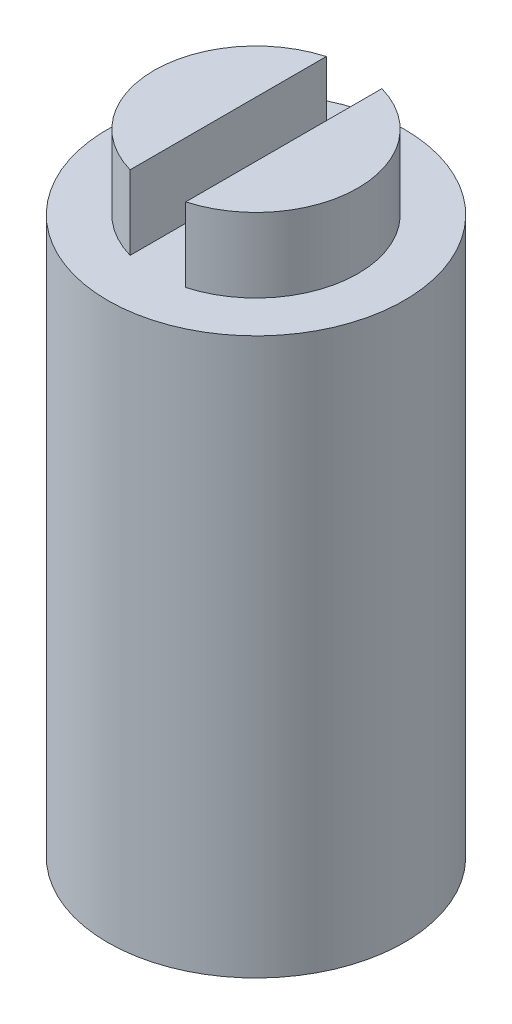
ISO-10303-21;
HEADER;
FILE_DESCRIPTION(('STEP AP214'),'2;1');
FILE_NAME('part.step','',(''),(''),'','','');
FILE_SCHEMA(('AUTOMOTIVE_DESIGN { 1 0 10303 214 1 1 1 1 }'));
ENDSEC;
DATA;
#1=APPLICATION_CONTEXT('core data for automotive mechanical design processes');
#2=APPLICATION_PROTOCOL_DEFINITION('international standard','automotive_design',2000,#1);
#3=PRODUCT_CONTEXT('',#1,'mechanical');
#4=PRODUCT('Part','Part','',(#3));
#5=PRODUCT_RELATED_PRODUCT_CATEGORY('part','',(#4));
#6=PRODUCT_DEFINITION_FORMATION('','',#4);
#7=PRODUCT_DEFINITION_CONTEXT('part definition',#1,'design');
#8=PRODUCT_DEFINITION('design','',#6,#7);
#9=PRODUCT_DEFINITION_SHAPE('','',#8);
#10=(LENGTH_UNIT() NAMED_UNIT(*) SI_UNIT(.MILLI.,.METRE.));
#11=(NAMED_UNIT(*) PLANE_ANGLE_UNIT() SI_UNIT($,.RADIAN.));
#12=(NAMED_UNIT(*) SI_UNIT($,.STERADIAN.) SOLID_ANGLE_UNIT());
#13=UNCERTAINTY_MEASURE_WITH_UNIT(LENGTH_MEASURE(1.E-05),#10,'distance_accuracy_value','');
#14=(GEOMETRIC_REPRESENTATION_CONTEXT(3) GLOBAL_UNCERTAINTY_ASSIGNED_CONTEXT((#13)) GLOBAL_UNIT_ASSIGNED_CONTEXT((#10,
#11,#12)) REPRESENTATION_CONTEXT('',''));
#15=CARTESIAN_POINT('',(0.,0.,0.));
#16=DIRECTION('',(0.,0.,1.));
#17=DIRECTION('',(1.,0.,0.));
#18=AXIS2_PLACEMENT_3D('',#15,#16,#17);
#19=CARTESIAN_POINT('',(0.,0.,0.));
#20=DIRECTION('',(0.,1.,0.));
#21=DIRECTION('',(0.,0.,1.));
#22=AXIS2_PLACEMENT_3D('',#19,#20,#21);
#23=PLANE('',#22);
#24=CARTESIAN_POINT('',(0.,0.,0.));
#25=DIRECTION('',(0.,1.,0.));
#26=DIRECTION('',(0.,0.,1.));
#27=AXIS2_PLACEMENT_3D('',#24,#25,#26);
#28=CIRCLE('',#27,4.);
#29=CARTESIAN_POINT('',(0.,0.,4.));
#30=VERTEX_POINT('',#29);
#31=EDGE_CURVE('E44',#30,#30,#28,.T.);
#32=ORIENTED_EDGE('',*,*,#31,.T.);
#33=EDGE_LOOP('',(#32));
#34=FACE_BOUND('',#33,.T.);
#35=DIRECTION('',(0.,0.,-1.));
#36=VECTOR('',#35,1.);
#37=CARTESIAN_POINT('',(-0.75,0.,-2.64575131106459));
#38=LINE('',#37,#36);
#39=CARTESIAN_POINT('',(-0.75,0.,2.64575131106459));
#40=VERTEX_POINT('',#39);
#41=CARTESIAN_POINT('',(-0.75,0.,-2.64575131106459));
#42=VERTEX_POINT('',#41);
#43=EDGE_CURVE('E99',#40,#42,#38,.T.);
#44=ORIENTED_EDGE('',*,*,#43,.F.);
#45=CARTESIAN_POINT('',(0.,0.,0.));
#46=DIRECTION('',(0.,1.,0.));
#47=DIRECTION('',(0.,0.,1.));
#48=AXIS2_PLACEMENT_3D('',#45,#46,#47);
#49=CIRCLE('',#48,2.75);
#50=EDGE_CURVE('E63',#42,#40,#49,.T.);
#51=ORIENTED_EDGE('',*,*,#50,.F.);
#52=EDGE_LOOP('',(#44,#51));
#53=FACE_BOUND('',#52,.T.);
#54=DIRECTION('',(0.,0.,1.));
#55=VECTOR('',#54,1.);
#56=CARTESIAN_POINT('',(0.75,0.,-2.64575131106459));
#57=LINE('',#56,#55);
#58=CARTESIAN_POINT('',(0.75,0.,-2.64575131106459));
#59=VERTEX_POINT('',#58);
#60=CARTESIAN_POINT('',(0.75,0.,2.64575131106459));
#61=VERTEX_POINT('',#60);
#62=EDGE_CURVE('E95',#59,#61,#57,.T.);
#63=ORIENTED_EDGE('',*,*,#62,.F.);
#64=CARTESIAN_POINT('',(0.,0.,0.));
#65=DIRECTION('',(0.,1.,0.));
#66=DIRECTION('',(0.,0.,1.));
#67=AXIS2_PLACEMENT_3D('',#64,#65,#66);
#68=CIRCLE('',#67,2.75);
#69=EDGE_CURVE('E55',#61,#59,#68,.T.);
#70=ORIENTED_EDGE('',*,*,#69,.F.);
#71=EDGE_LOOP('',(#63,#70));
#72=FACE_BOUND('',#71,.T.);
#73=ADVANCED_FACE('F40',(#34,#53,#72),#23,.T.);
#74=CARTESIAN_POINT('',(0.,-15.,0.));
#75=DIRECTION('',(0.,1.,0.));
#76=DIRECTION('',(0.,0.,1.));
#77=AXIS2_PLACEMENT_3D('',#74,#75,#76);
#78=CYLINDRICAL_SURFACE('',#77,4.);
#79=CARTESIAN_POINT('',(0.,-15.,0.));
#80=DIRECTION('',(0.,1.,0.));
#81=DIRECTION('',(0.,0.,1.));
#82=AXIS2_PLACEMENT_3D('',#79,#80,#81);
#83=CIRCLE('',#82,4.);
#84=CARTESIAN_POINT('',(0.,-15.,4.));
#85=VERTEX_POINT('',#84);
#86=EDGE_CURVE('E11',#85,#85,#83,.T.);
#87=ORIENTED_EDGE('',*,*,#86,.T.);
#88=EDGE_LOOP('',(#87));
#89=FACE_BOUND('',#88,.T.);
#90=ORIENTED_EDGE('',*,*,#31,.F.);
#91=EDGE_LOOP('',(#90));
#92=FACE_BOUND('',#91,.T.);
#93=ADVANCED_FACE('F42',(#89,#92),#78,.T.);
#94=CARTESIAN_POINT('',(0.,-15.,0.));
#95=DIRECTION('',(0.,1.,0.));
#96=DIRECTION('',(0.,0.,1.));
#97=AXIS2_PLACEMENT_3D('',#94,#95,#96);
#98=PLANE('',#97);
#99=ORIENTED_EDGE('',*,*,#86,.F.);
#100=EDGE_LOOP('',(#99));
#101=FACE_BOUND('',#100,.T.);
#102=ADVANCED_FACE('F121',(#101),#98,.F.);
#103=CARTESIAN_POINT('',(0.,2.,0.));
#104=DIRECTION('',(0.,-1.,0.));
#105=DIRECTION('',(0.,0.,-1.));
#106=AXIS2_PLACEMENT_3D('',#103,#104,#105);
#107=CYLINDRICAL_SURFACE('',#106,2.75);
#108=ORIENTED_EDGE('',*,*,#50,.T.);
#109=DIRECTION('',(0.,-1.,0.));
#110=VECTOR('',#109,1.);
#111=CARTESIAN_POINT('',(-0.75,2.,2.64575131106459));
#112=LINE('',#111,#110);
#113=CARTESIAN_POINT('',(-0.75,2.,2.64575131106459));
#114=VERTEX_POINT('',#113);
#115=EDGE_CURVE('E112',#114,#40,#112,.T.);
#116=ORIENTED_EDGE('',*,*,#115,.F.);
#117=CARTESIAN_POINT('',(0.,2.,0.));
#118=DIRECTION('',(0.,1.,0.));
#119=DIRECTION('',(0.,0.,1.));
#120=AXIS2_PLACEMENT_3D('',#117,#118,#119);
#121=CIRCLE('',#120,2.75);
#122=CARTESIAN_POINT('',(-0.75,2.,-2.64575131106459));
#123=VERTEX_POINT('',#122);
#124=EDGE_CURVE('E104',#123,#114,#121,.T.);
#125=ORIENTED_EDGE('',*,*,#124,.F.);
#126=DIRECTION('',(0.,-1.,0.));
#127=VECTOR('',#126,1.);
#128=CARTESIAN_POINT('',(-0.75,2.,-2.64575131106459));
#129=LINE('',#128,#127);
#130=EDGE_CURVE('E108',#123,#42,#129,.T.);
#131=ORIENTED_EDGE('',*,*,#130,.T.);
#132=EDGE_LOOP('',(#108,#116,#125,#131));
#133=FACE_BOUND('',#132,.T.);
#134=ADVANCED_FACE('F127',(#133),#107,.T.);
#135=CARTESIAN_POINT('',(-0.75,2.,-2.64575131106459));
#136=DIRECTION('',(-1.,0.,0.));
#137=DIRECTION('',(0.,0.,1.));
#138=AXIS2_PLACEMENT_3D('',#135,#136,#137);
#139=PLANE('',#138);
#140=ORIENTED_EDGE('',*,*,#43,.T.);
#141=ORIENTED_EDGE('',*,*,#130,.F.);
#142=DIRECTION('',(0.,0.,-1.));
#143=VECTOR('',#142,1.);
#144=CARTESIAN_POINT('',(-0.75,2.,-2.64575131106459));
#145=LINE('',#144,#143);
#146=EDGE_CURVE('E107',#114,#123,#145,.T.);
#147=ORIENTED_EDGE('',*,*,#146,.F.);
#148=ORIENTED_EDGE('',*,*,#115,.T.);
#149=EDGE_LOOP('',(#140,#141,#147,#148));
#150=FACE_BOUND('',#149,.T.);
#151=ADVANCED_FACE('F136',(#150),#139,.F.);
#152=CARTESIAN_POINT('',(0.,2.,0.));
#153=DIRECTION('',(0.,1.,0.));
#154=DIRECTION('',(0.,0.,1.));
#155=AXIS2_PLACEMENT_3D('',#152,#153,#154);
#156=PLANE('',#155);
#157=ORIENTED_EDGE('',*,*,#124,.T.);
#158=ORIENTED_EDGE('',*,*,#146,.T.);
#159=EDGE_LOOP('',(#157,#158));
#160=FACE_BOUND('',#159,.T.);
#161=ADVANCED_FACE('F139',(#160),#156,.T.);
#162=CARTESIAN_POINT('',(0.,2.,0.));
#163=DIRECTION('',(0.,-1.,0.));
#164=DIRECTION('',(0.,0.,-1.));
#165=AXIS2_PLACEMENT_3D('',#162,#163,#164);
#166=CYLINDRICAL_SURFACE('',#165,2.75);
#167=ORIENTED_EDGE('',*,*,#69,.T.);
#168=DIRECTION('',(0.,-1.,0.));
#169=VECTOR('',#168,1.);
#170=CARTESIAN_POINT('',(0.75,2.,-2.64575131106459));
#171=LINE('',#170,#169);
#172=CARTESIAN_POINT('',(0.75,2.,-2.64575131106459));
#173=VERTEX_POINT('',#172);
#174=EDGE_CURVE('E87',#173,#59,#171,.T.);
#175=ORIENTED_EDGE('',*,*,#174,.F.);
#176=CARTESIAN_POINT('',(0.,2.,0.));
#177=DIRECTION('',(0.,1.,0.));
#178=DIRECTION('',(0.,0.,1.));
#179=AXIS2_PLACEMENT_3D('',#176,#177,#178);
#180=CIRCLE('',#179,2.75);
#181=CARTESIAN_POINT('',(0.75,2.,2.64575131106459));
#182=VERTEX_POINT('',#181);
#183=EDGE_CURVE('E92',#182,#173,#180,.T.);
#184=ORIENTED_EDGE('',*,*,#183,.F.);
#185=DIRECTION('',(0.,-1.,0.));
#186=VECTOR('',#185,1.);
#187=CARTESIAN_POINT('',(0.75,2.,2.64575131106459));
#188=LINE('',#187,#186);
#189=EDGE_CURVE('E89',#182,#61,#188,.T.);
#190=ORIENTED_EDGE('',*,*,#189,.T.);
#191=EDGE_LOOP('',(#167,#175,#184,#190));
#192=FACE_BOUND('',#191,.T.);
#193=ADVANCED_FACE('F97',(#192),#166,.T.);
#194=CARTESIAN_POINT('',(0.75,2.,-2.64575131106459));
#195=DIRECTION('',(1.,0.,0.));
#196=DIRECTION('',(0.,0.,-1.));
#197=AXIS2_PLACEMENT_3D('',#194,#195,#196);
#198=PLANE('',#197);
#199=ORIENTED_EDGE('',*,*,#62,.T.);
#200=ORIENTED_EDGE('',*,*,#189,.F.);
#201=DIRECTION('',(0.,0.,1.));
#202=VECTOR('',#201,1.);
#203=CARTESIAN_POINT('',(0.75,2.,-2.64575131106459));
#204=LINE('',#203,#202);
#205=EDGE_CURVE('E84',#173,#182,#204,.T.);
#206=ORIENTED_EDGE('',*,*,#205,.F.);
#207=ORIENTED_EDGE('',*,*,#174,.T.);
#208=EDGE_LOOP('',(#199,#200,#206,#207));
#209=FACE_BOUND('',#208,.T.);
#210=ADVANCED_FACE('F86',(#209),#198,.F.);
#211=CARTESIAN_POINT('',(0.,2.,0.));
#212=DIRECTION('',(0.,1.,0.));
#213=DIRECTION('',(0.,0.,1.));
#214=AXIS2_PLACEMENT_3D('',#211,#212,#213);
#215=PLANE('',#214);
#216=ORIENTED_EDGE('',*,*,#183,.T.);
#217=ORIENTED_EDGE('',*,*,#205,.T.);
#218=EDGE_LOOP('',(#216,#217));
#219=FACE_BOUND('',#218,.T.);
#220=ADVANCED_FACE('F94',(#219),#215,.T.);
#221=CLOSED_SHELL('',(#73,#93,#102,#134,#151,#161,#193,#210,#220));
#222=MANIFOLD_SOLID_BREP('B2',#221);
#223=ADVANCED_BREP_SHAPE_REPRESENTATION('',(#18,#222),#14);
#224=SHAPE_DEFINITION_REPRESENTATION(#9,#223);
ENDSEC;
END-ISO-10303-21;
